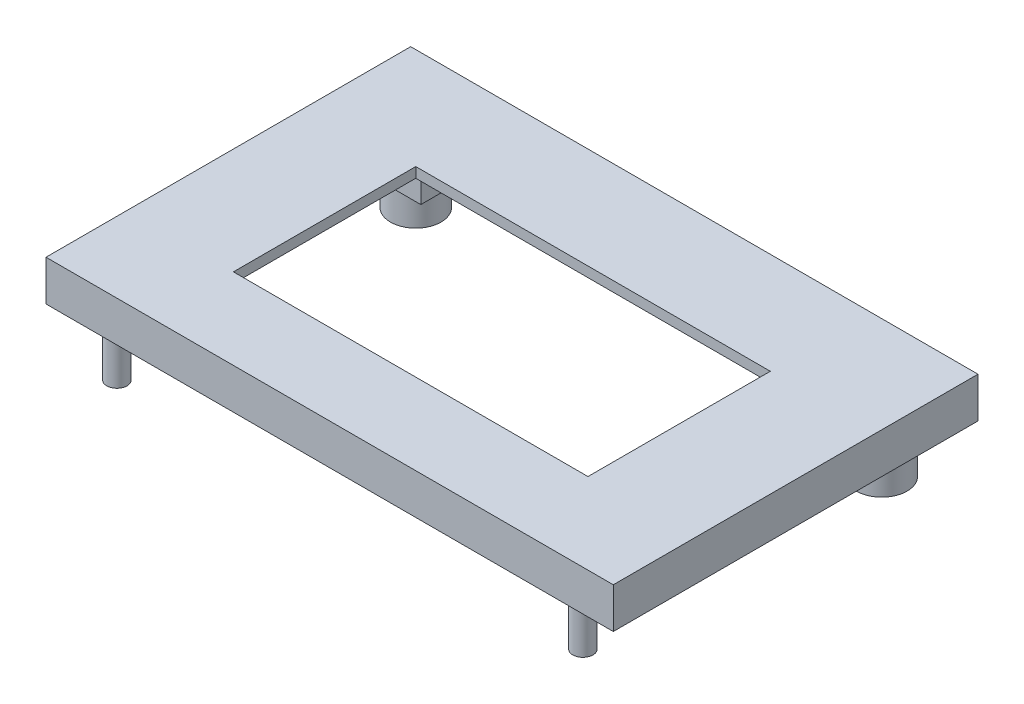
ISO-10303-21;
HEADER;
FILE_DESCRIPTION(('STEP AP214'),'2;1');
FILE_NAME('part.step','',(''),(''),'','','');
FILE_SCHEMA(('AUTOMOTIVE_DESIGN { 1 0 10303 214 1 1 1 1 }'));
ENDSEC;
DATA;
#1=APPLICATION_CONTEXT('core data for automotive mechanical design processes');
#2=APPLICATION_PROTOCOL_DEFINITION('international standard','automotive_design',2000,#1);
#3=PRODUCT_CONTEXT('',#1,'mechanical');
#4=PRODUCT('Part','Part','',(#3));
#5=PRODUCT_RELATED_PRODUCT_CATEGORY('part','',(#4));
#6=PRODUCT_DEFINITION_FORMATION('','',#4);
#7=PRODUCT_DEFINITION_CONTEXT('part definition',#1,'design');
#8=PRODUCT_DEFINITION('design','',#6,#7);
#9=PRODUCT_DEFINITION_SHAPE('','',#8);
#10=(LENGTH_UNIT() NAMED_UNIT(*) SI_UNIT(.MILLI.,.METRE.));
#11=(NAMED_UNIT(*) PLANE_ANGLE_UNIT() SI_UNIT($,.RADIAN.));
#12=(NAMED_UNIT(*) SI_UNIT($,.STERADIAN.) SOLID_ANGLE_UNIT());
#13=UNCERTAINTY_MEASURE_WITH_UNIT(LENGTH_MEASURE(1.E-05),#10,'distance_accuracy_value','');
#14=(GEOMETRIC_REPRESENTATION_CONTEXT(3) GLOBAL_UNCERTAINTY_ASSIGNED_CONTEXT((#13)) GLOBAL_UNIT_ASSIGNED_CONTEXT((#10,
#11,#12)) REPRESENTATION_CONTEXT('',''));
#15=CARTESIAN_POINT('',(0.,0.,0.));
#16=DIRECTION('',(0.,0.,1.));
#17=DIRECTION('',(1.,0.,0.));
#18=AXIS2_PLACEMENT_3D('',#15,#16,#17);
#19=CARTESIAN_POINT('',(0.,3.,32.));
#20=DIRECTION('',(0.,0.,-1.));
#21=DIRECTION('',(-1.,0.,0.));
#22=AXIS2_PLACEMENT_3D('',#19,#20,#21);
#23=PLANE('',#22);
#24=DIRECTION('',(1.,0.,0.));
#25=VECTOR('',#24,1.);
#26=CARTESIAN_POINT('',(0.,0.,32.));
#27=LINE('',#26,#25);
#28=CARTESIAN_POINT('',(46.,0.,32.));
#29=VERTEX_POINT('',#28);
#30=CARTESIAN_POINT('',(55.,0.,32.));
#31=VERTEX_POINT('',#30);
#32=EDGE_CURVE('E131',#29,#31,#27,.T.);
#33=ORIENTED_EDGE('',*,*,#32,.F.);
#34=DIRECTION('',(0.,-1.,0.));
#35=VECTOR('',#34,1.);
#36=CARTESIAN_POINT('',(46.,3.,32.));
#37=LINE('',#36,#35);
#38=CARTESIAN_POINT('',(46.,3.,32.));
#39=VERTEX_POINT('',#38);
#40=EDGE_CURVE('E163',#39,#29,#37,.T.);
#41=ORIENTED_EDGE('',*,*,#40,.F.);
#42=DIRECTION('',(1.,0.,0.));
#43=VECTOR('',#42,1.);
#44=CARTESIAN_POINT('',(0.,3.,32.));
#45=LINE('',#44,#43);
#46=CARTESIAN_POINT('',(55.,3.,32.));
#47=VERTEX_POINT('',#46);
#48=EDGE_CURVE('E132',#39,#47,#45,.T.);
#49=ORIENTED_EDGE('',*,*,#48,.T.);
#50=DIRECTION('',(0.,-1.,0.));
#51=VECTOR('',#50,1.);
#52=CARTESIAN_POINT('',(55.,3.,32.));
#53=LINE('',#52,#51);
#54=EDGE_CURVE('E115',#47,#31,#53,.T.);
#55=ORIENTED_EDGE('',*,*,#54,.T.);
#56=EDGE_LOOP('',(#33,#41,#49,#55));
#57=FACE_BOUND('',#56,.T.);
#58=ADVANCED_FACE('F37',(#57),#23,.T.);
#59=CARTESIAN_POINT('',(46.,3.,0.));
#60=DIRECTION('',(1.,0.,0.));
#61=DIRECTION('',(0.,0.,-1.));
#62=AXIS2_PLACEMENT_3D('',#59,#60,#61);
#63=PLANE('',#62);
#64=DIRECTION('',(0.,0.,1.));
#65=VECTOR('',#64,1.);
#66=CARTESIAN_POINT('',(46.,0.,0.));
#67=LINE('',#66,#65);
#68=CARTESIAN_POINT('',(46.,0.,35.));
#69=VERTEX_POINT('',#68);
#70=EDGE_CURVE('E217',#29,#69,#67,.T.);
#71=ORIENTED_EDGE('',*,*,#70,.T.);
#72=DIRECTION('',(0.,-1.,0.));
#73=VECTOR('',#72,1.);
#74=CARTESIAN_POINT('',(46.,3.,35.));
#75=LINE('',#74,#73);
#76=CARTESIAN_POINT('',(46.,3.,35.));
#77=VERTEX_POINT('',#76);
#78=EDGE_CURVE('E161',#77,#69,#75,.T.);
#79=ORIENTED_EDGE('',*,*,#78,.F.);
#80=DIRECTION('',(0.,0.,1.));
#81=VECTOR('',#80,1.);
#82=CARTESIAN_POINT('',(46.,3.,0.));
#83=LINE('',#82,#81);
#84=EDGE_CURVE('E135',#39,#77,#83,.T.);
#85=ORIENTED_EDGE('',*,*,#84,.F.);
#86=ORIENTED_EDGE('',*,*,#40,.T.);
#87=EDGE_LOOP('',(#71,#79,#85,#86));
#88=FACE_BOUND('',#87,.T.);
#89=ADVANCED_FACE('F280',(#88),#63,.F.);
#90=CARTESIAN_POINT('',(0.,3.,35.));
#91=DIRECTION('',(0.,0.,-1.));
#92=DIRECTION('',(-1.,0.,0.));
#93=AXIS2_PLACEMENT_3D('',#90,#91,#92);
#94=PLANE('',#93);
#95=DIRECTION('',(1.,0.,0.));
#96=VECTOR('',#95,1.);
#97=CARTESIAN_POINT('',(0.,0.,35.));
#98=LINE('',#97,#96);
#99=CARTESIAN_POINT('',(10.,0.,35.));
#100=VERTEX_POINT('',#99);
#101=EDGE_CURVE('E221',#100,#69,#98,.T.);
#102=ORIENTED_EDGE('',*,*,#101,.F.);
#103=DIRECTION('',(0.,-1.,0.));
#104=VECTOR('',#103,1.);
#105=CARTESIAN_POINT('',(10.,3.,35.));
#106=LINE('',#105,#104);
#107=CARTESIAN_POINT('',(10.,3.,35.));
#108=VERTEX_POINT('',#107);
#109=EDGE_CURVE('E159',#108,#100,#106,.T.);
#110=ORIENTED_EDGE('',*,*,#109,.F.);
#111=DIRECTION('',(1.,0.,0.));
#112=VECTOR('',#111,1.);
#113=CARTESIAN_POINT('',(0.,3.,35.));
#114=LINE('',#113,#112);
#115=EDGE_CURVE('E282',#108,#77,#114,.T.);
#116=ORIENTED_EDGE('',*,*,#115,.T.);
#117=ORIENTED_EDGE('',*,*,#78,.T.);
#118=EDGE_LOOP('',(#102,#110,#116,#117));
#119=FACE_BOUND('',#118,.T.);
#120=ADVANCED_FACE('F319',(#119),#94,.T.);
#121=CARTESIAN_POINT('',(10.,3.,0.));
#122=DIRECTION('',(1.,0.,0.));
#123=DIRECTION('',(0.,0.,-1.));
#124=AXIS2_PLACEMENT_3D('',#121,#122,#123);
#125=PLANE('',#124);
#126=DIRECTION('',(0.,0.,1.));
#127=VECTOR('',#126,1.);
#128=CARTESIAN_POINT('',(10.,0.,0.));
#129=LINE('',#128,#127);
#130=CARTESIAN_POINT('',(10.,0.,32.));
#131=VERTEX_POINT('',#130);
#132=EDGE_CURVE('E224',#131,#100,#129,.T.);
#133=ORIENTED_EDGE('',*,*,#132,.F.);
#134=DIRECTION('',(0.,-1.,0.));
#135=VECTOR('',#134,1.);
#136=CARTESIAN_POINT('',(10.,3.,32.));
#137=LINE('',#136,#135);
#138=CARTESIAN_POINT('',(10.,3.,32.));
#139=VERTEX_POINT('',#138);
#140=EDGE_CURVE('E157',#139,#131,#137,.T.);
#141=ORIENTED_EDGE('',*,*,#140,.F.);
#142=DIRECTION('',(0.,0.,1.));
#143=VECTOR('',#142,1.);
#144=CARTESIAN_POINT('',(10.,3.,0.));
#145=LINE('',#144,#143);
#146=EDGE_CURVE('E284',#139,#108,#145,.T.);
#147=ORIENTED_EDGE('',*,*,#146,.T.);
#148=ORIENTED_EDGE('',*,*,#109,.T.);
#149=EDGE_LOOP('',(#133,#141,#147,#148));
#150=FACE_BOUND('',#149,.T.);
#151=ADVANCED_FACE('F315',(#150),#125,.T.);
#152=CARTESIAN_POINT('',(1.,0.,32.));
#153=VERTEX_POINT('',#152);
#154=EDGE_CURVE('E218',#153,#131,#27,.T.);
#155=ORIENTED_EDGE('',*,*,#154,.F.);
#156=DIRECTION('',(0.,-1.,0.));
#157=VECTOR('',#156,1.);
#158=CARTESIAN_POINT('',(1.,3.,32.));
#159=LINE('',#158,#157);
#160=CARTESIAN_POINT('',(1.,3.,32.));
#161=VERTEX_POINT('',#160);
#162=EDGE_CURVE('E155',#161,#153,#159,.T.);
#163=ORIENTED_EDGE('',*,*,#162,.F.);
#164=EDGE_CURVE('E137',#161,#139,#45,.T.);
#165=ORIENTED_EDGE('',*,*,#164,.T.);
#166=ORIENTED_EDGE('',*,*,#140,.T.);
#167=EDGE_LOOP('',(#155,#163,#165,#166));
#168=FACE_BOUND('',#167,.T.);
#169=ADVANCED_FACE('F309',(#168),#23,.T.);
#170=CARTESIAN_POINT('',(1.,3.,0.));
#171=DIRECTION('',(-1.,0.,0.));
#172=DIRECTION('',(0.,0.,1.));
#173=AXIS2_PLACEMENT_3D('',#170,#171,#172);
#174=PLANE('',#173);
#175=DIRECTION('',(0.,0.,-1.));
#176=VECTOR('',#175,1.);
#177=CARTESIAN_POINT('',(1.,0.,0.));
#178=LINE('',#177,#176);
#179=CARTESIAN_POINT('',(1.,0.,9.));
#180=VERTEX_POINT('',#179);
#181=EDGE_CURVE('E227',#153,#180,#178,.T.);
#182=ORIENTED_EDGE('',*,*,#181,.T.);
#183=DIRECTION('',(0.,-1.,0.));
#184=VECTOR('',#183,1.);
#185=CARTESIAN_POINT('',(1.,3.,9.));
#186=LINE('',#185,#184);
#187=CARTESIAN_POINT('',(1.,3.,9.));
#188=VERTEX_POINT('',#187);
#189=EDGE_CURVE('E152',#188,#180,#186,.T.);
#190=ORIENTED_EDGE('',*,*,#189,.F.);
#191=DIRECTION('',(0.,0.,-1.));
#192=VECTOR('',#191,1.);
#193=CARTESIAN_POINT('',(1.,3.,0.));
#194=LINE('',#193,#192);
#195=EDGE_CURVE('E289',#161,#188,#194,.T.);
#196=ORIENTED_EDGE('',*,*,#195,.F.);
#197=ORIENTED_EDGE('',*,*,#162,.T.);
#198=EDGE_LOOP('',(#182,#190,#196,#197));
#199=FACE_BOUND('',#198,.T.);
#200=ADVANCED_FACE('F320',(#199),#174,.F.);
#201=CARTESIAN_POINT('',(0.,3.,9.));
#202=DIRECTION('',(0.,0.,-1.));
#203=DIRECTION('',(-1.,0.,0.));
#204=AXIS2_PLACEMENT_3D('',#201,#202,#203);
#205=PLANE('',#204);
#206=DIRECTION('',(1.,0.,0.));
#207=VECTOR('',#206,1.);
#208=CARTESIAN_POINT('',(0.,0.,9.));
#209=LINE('',#208,#207);
#210=CARTESIAN_POINT('',(10.,0.,9.));
#211=VERTEX_POINT('',#210);
#212=EDGE_CURVE('E126',#180,#211,#209,.T.);
#213=ORIENTED_EDGE('',*,*,#212,.T.);
#214=DIRECTION('',(0.,-1.,0.));
#215=VECTOR('',#214,1.);
#216=CARTESIAN_POINT('',(10.,3.,9.));
#217=LINE('',#216,#215);
#218=CARTESIAN_POINT('',(10.,3.,9.));
#219=VERTEX_POINT('',#218);
#220=EDGE_CURVE('E149',#219,#211,#217,.T.);
#221=ORIENTED_EDGE('',*,*,#220,.F.);
#222=DIRECTION('',(1.,0.,0.));
#223=VECTOR('',#222,1.);
#224=CARTESIAN_POINT('',(0.,3.,9.));
#225=LINE('',#224,#223);
#226=EDGE_CURVE('E291',#188,#219,#225,.T.);
#227=ORIENTED_EDGE('',*,*,#226,.F.);
#228=ORIENTED_EDGE('',*,*,#189,.T.);
#229=EDGE_LOOP('',(#213,#221,#227,#228));
#230=FACE_BOUND('',#229,.T.);
#231=ADVANCED_FACE('F301',(#230),#205,.F.);
#232=CARTESIAN_POINT('',(10.,3.,0.));
#233=DIRECTION('',(-1.,0.,0.));
#234=DIRECTION('',(0.,0.,1.));
#235=AXIS2_PLACEMENT_3D('',#232,#233,#234);
#236=PLANE('',#235);
#237=DIRECTION('',(0.,0.,-1.));
#238=VECTOR('',#237,1.);
#239=CARTESIAN_POINT('',(10.,0.,0.));
#240=LINE('',#239,#238);
#241=CARTESIAN_POINT('',(10.,0.,1.));
#242=VERTEX_POINT('',#241);
#243=EDGE_CURVE('E231',#211,#242,#240,.T.);
#244=ORIENTED_EDGE('',*,*,#243,.T.);
#245=DIRECTION('',(0.,-1.,0.));
#246=VECTOR('',#245,1.);
#247=CARTESIAN_POINT('',(10.,3.,1.));
#248=LINE('',#247,#246);
#249=CARTESIAN_POINT('',(10.,3.,1.));
#250=VERTEX_POINT('',#249);
#251=EDGE_CURVE('E146',#250,#242,#248,.T.);
#252=ORIENTED_EDGE('',*,*,#251,.F.);
#253=DIRECTION('',(0.,0.,-1.));
#254=VECTOR('',#253,1.);
#255=CARTESIAN_POINT('',(10.,3.,0.));
#256=LINE('',#255,#254);
#257=EDGE_CURVE('E293',#219,#250,#256,.T.);
#258=ORIENTED_EDGE('',*,*,#257,.F.);
#259=ORIENTED_EDGE('',*,*,#220,.T.);
#260=EDGE_LOOP('',(#244,#252,#258,#259));
#261=FACE_BOUND('',#260,.T.);
#262=ADVANCED_FACE('F299',(#261),#236,.F.);
#263=CARTESIAN_POINT('',(0.,3.,1.));
#264=DIRECTION('',(0.,0.,-1.));
#265=DIRECTION('',(-1.,0.,0.));
#266=AXIS2_PLACEMENT_3D('',#263,#264,#265);
#267=PLANE('',#266);
#268=DIRECTION('',(1.,0.,0.));
#269=VECTOR('',#268,1.);
#270=CARTESIAN_POINT('',(0.,0.,1.));
#271=LINE('',#270,#269);
#272=CARTESIAN_POINT('',(46.,0.,1.));
#273=VERTEX_POINT('',#272);
#274=EDGE_CURVE('E233',#242,#273,#271,.T.);
#275=ORIENTED_EDGE('',*,*,#274,.T.);
#276=DIRECTION('',(0.,-1.,0.));
#277=VECTOR('',#276,1.);
#278=CARTESIAN_POINT('',(46.,3.,1.));
#279=LINE('',#278,#277);
#280=CARTESIAN_POINT('',(46.,3.,1.));
#281=VERTEX_POINT('',#280);
#282=EDGE_CURVE('E144',#281,#273,#279,.T.);
#283=ORIENTED_EDGE('',*,*,#282,.F.);
#284=DIRECTION('',(1.,0.,0.));
#285=VECTOR('',#284,1.);
#286=CARTESIAN_POINT('',(0.,3.,1.));
#287=LINE('',#286,#285);
#288=EDGE_CURVE('E247',#250,#281,#287,.T.);
#289=ORIENTED_EDGE('',*,*,#288,.F.);
#290=ORIENTED_EDGE('',*,*,#251,.T.);
#291=EDGE_LOOP('',(#275,#283,#289,#290));
#292=FACE_BOUND('',#291,.T.);
#293=ADVANCED_FACE('F244',(#292),#267,.F.);
#294=CARTESIAN_POINT('',(46.,3.,0.));
#295=DIRECTION('',(-1.,0.,0.));
#296=DIRECTION('',(0.,0.,1.));
#297=AXIS2_PLACEMENT_3D('',#294,#295,#296);
#298=PLANE('',#297);
#299=DIRECTION('',(0.,0.,-1.));
#300=VECTOR('',#299,1.);
#301=CARTESIAN_POINT('',(46.,0.,0.));
#302=LINE('',#301,#300);
#303=CARTESIAN_POINT('',(46.,0.,9.));
#304=VERTEX_POINT('',#303);
#305=EDGE_CURVE('E124',#304,#273,#302,.T.);
#306=ORIENTED_EDGE('',*,*,#305,.F.);
#307=DIRECTION('',(0.,-1.,0.));
#308=VECTOR('',#307,1.);
#309=CARTESIAN_POINT('',(46.,3.,9.));
#310=LINE('',#309,#308);
#311=CARTESIAN_POINT('',(46.,3.,9.));
#312=VERTEX_POINT('',#311);
#313=EDGE_CURVE('E114',#312,#304,#310,.T.);
#314=ORIENTED_EDGE('',*,*,#313,.F.);
#315=DIRECTION('',(0.,0.,-1.));
#316=VECTOR('',#315,1.);
#317=CARTESIAN_POINT('',(46.,3.,0.));
#318=LINE('',#317,#316);
#319=EDGE_CURVE('E242',#312,#281,#318,.T.);
#320=ORIENTED_EDGE('',*,*,#319,.T.);
#321=ORIENTED_EDGE('',*,*,#282,.T.);
#322=EDGE_LOOP('',(#306,#314,#320,#321));
#323=FACE_BOUND('',#322,.T.);
#324=ADVANCED_FACE('F238',(#323),#298,.T.);
#325=CARTESIAN_POINT('',(55.,0.,9.));
#326=VERTEX_POINT('',#325);
#327=EDGE_CURVE('E118',#304,#326,#209,.T.);
#328=ORIENTED_EDGE('',*,*,#327,.T.);
#329=DIRECTION('',(0.,-1.,0.));
#330=VECTOR('',#329,1.);
#331=CARTESIAN_POINT('',(55.,3.,9.));
#332=LINE('',#331,#330);
#333=CARTESIAN_POINT('',(55.,3.,9.));
#334=VERTEX_POINT('',#333);
#335=EDGE_CURVE('E106',#334,#326,#332,.T.);
#336=ORIENTED_EDGE('',*,*,#335,.F.);
#337=EDGE_CURVE('E53',#312,#334,#225,.T.);
#338=ORIENTED_EDGE('',*,*,#337,.F.);
#339=ORIENTED_EDGE('',*,*,#313,.T.);
#340=EDGE_LOOP('',(#328,#336,#338,#339));
#341=FACE_BOUND('',#340,.T.);
#342=ADVANCED_FACE('F119',(#341),#205,.F.);
#343=CARTESIAN_POINT('',(56.,3.,0.));
#344=DIRECTION('',(1.,0.,0.));
#345=DIRECTION('',(0.,0.,-1.));
#346=AXIS2_PLACEMENT_3D('',#343,#344,#345);
#347=PLANE('',#346);
#348=DIRECTION('',(0.,0.,1.));
#349=VECTOR('',#348,1.);
#350=CARTESIAN_POINT('',(56.,0.,0.));
#351=LINE('',#350,#349);
#352=CARTESIAN_POINT('',(56.,0.,0.));
#353=VERTEX_POINT('',#352);
#354=CARTESIAN_POINT('',(56.,0.,36.));
#355=VERTEX_POINT('',#354);
#356=EDGE_CURVE('E196',#353,#355,#351,.T.);
#357=ORIENTED_EDGE('',*,*,#356,.F.);
#358=DIRECTION('',(0.,-1.,0.));
#359=VECTOR('',#358,1.);
#360=CARTESIAN_POINT('',(56.,3.,0.));
#361=LINE('',#360,#359);
#362=CARTESIAN_POINT('',(56.,4.,0.));
#363=VERTEX_POINT('',#362);
#364=EDGE_CURVE('E141',#363,#353,#361,.T.);
#365=ORIENTED_EDGE('',*,*,#364,.F.);
#366=DIRECTION('',(0.,0.,-1.));
#367=VECTOR('',#366,1.);
#368=CARTESIAN_POINT('',(56.,4.,0.));
#369=LINE('',#368,#367);
#370=CARTESIAN_POINT('',(56.,4.,36.));
#371=VERTEX_POINT('',#370);
#372=EDGE_CURVE('E209',#371,#363,#369,.T.);
#373=ORIENTED_EDGE('',*,*,#372,.F.);
#374=DIRECTION('',(0.,-1.,0.));
#375=VECTOR('',#374,1.);
#376=CARTESIAN_POINT('',(56.,3.,36.));
#377=LINE('',#376,#375);
#378=EDGE_CURVE('E166',#371,#355,#377,.T.);
#379=ORIENTED_EDGE('',*,*,#378,.T.);
#380=EDGE_LOOP('',(#357,#365,#373,#379));
#381=FACE_BOUND('',#380,.T.);
#382=ADVANCED_FACE('F39',(#381),#347,.T.);
#383=CARTESIAN_POINT('',(0.,3.,0.));
#384=DIRECTION('',(0.,0.,-1.));
#385=DIRECTION('',(-1.,0.,0.));
#386=AXIS2_PLACEMENT_3D('',#383,#384,#385);
#387=PLANE('',#386);
#388=DIRECTION('',(1.,0.,0.));
#389=VECTOR('',#388,1.);
#390=CARTESIAN_POINT('',(0.,0.,0.));
#391=LINE('',#390,#389);
#392=CARTESIAN_POINT('',(0.,0.,0.));
#393=VERTEX_POINT('',#392);
#394=EDGE_CURVE('E201',#393,#353,#391,.T.);
#395=ORIENTED_EDGE('',*,*,#394,.F.);
#396=DIRECTION('',(0.,-1.,0.));
#397=VECTOR('',#396,1.);
#398=CARTESIAN_POINT('',(0.,3.,0.));
#399=LINE('',#398,#397);
#400=CARTESIAN_POINT('',(0.,4.,0.));
#401=VERTEX_POINT('',#400);
#402=EDGE_CURVE('E171',#401,#393,#399,.T.);
#403=ORIENTED_EDGE('',*,*,#402,.F.);
#404=DIRECTION('',(-1.,0.,0.));
#405=VECTOR('',#404,1.);
#406=CARTESIAN_POINT('',(0.,4.,0.));
#407=LINE('',#406,#405);
#408=EDGE_CURVE('E204',#363,#401,#407,.T.);
#409=ORIENTED_EDGE('',*,*,#408,.F.);
#410=ORIENTED_EDGE('',*,*,#364,.T.);
#411=EDGE_LOOP('',(#395,#403,#409,#410));
#412=FACE_BOUND('',#411,.T.);
#413=ADVANCED_FACE('F346',(#412),#387,.T.);
#414=CARTESIAN_POINT('',(0.,3.,0.));
#415=DIRECTION('',(1.,0.,0.));
#416=DIRECTION('',(0.,0.,-1.));
#417=AXIS2_PLACEMENT_3D('',#414,#415,#416);
#418=PLANE('',#417);
#419=DIRECTION('',(0.,0.,1.));
#420=VECTOR('',#419,1.);
#421=CARTESIAN_POINT('',(0.,0.,0.));
#422=LINE('',#421,#420);
#423=CARTESIAN_POINT('',(0.,0.,36.));
#424=VERTEX_POINT('',#423);
#425=EDGE_CURVE('E206',#393,#424,#422,.T.);
#426=ORIENTED_EDGE('',*,*,#425,.T.);
#427=DIRECTION('',(0.,-1.,0.));
#428=VECTOR('',#427,1.);
#429=CARTESIAN_POINT('',(0.,3.,36.));
#430=LINE('',#429,#428);
#431=CARTESIAN_POINT('',(0.,4.,36.));
#432=VERTEX_POINT('',#431);
#433=EDGE_CURVE('E168',#432,#424,#430,.T.);
#434=ORIENTED_EDGE('',*,*,#433,.F.);
#435=DIRECTION('',(0.,0.,1.));
#436=VECTOR('',#435,1.);
#437=CARTESIAN_POINT('',(0.,4.,0.));
#438=LINE('',#437,#436);
#439=EDGE_CURVE('E369',#401,#432,#438,.T.);
#440=ORIENTED_EDGE('',*,*,#439,.F.);
#441=ORIENTED_EDGE('',*,*,#402,.T.);
#442=EDGE_LOOP('',(#426,#434,#440,#441));
#443=FACE_BOUND('',#442,.T.);
#444=ADVANCED_FACE('F343',(#443),#418,.F.);
#445=CARTESIAN_POINT('',(0.,3.,36.));
#446=DIRECTION('',(0.,0.,-1.));
#447=DIRECTION('',(-1.,0.,0.));
#448=AXIS2_PLACEMENT_3D('',#445,#446,#447);
#449=PLANE('',#448);
#450=DIRECTION('',(1.,0.,0.));
#451=VECTOR('',#450,1.);
#452=CARTESIAN_POINT('',(0.,0.,36.));
#453=LINE('',#452,#451);
#454=EDGE_CURVE('E199',#424,#355,#453,.T.);
#455=ORIENTED_EDGE('',*,*,#454,.T.);
#456=ORIENTED_EDGE('',*,*,#378,.F.);
#457=DIRECTION('',(1.,0.,0.));
#458=VECTOR('',#457,1.);
#459=CARTESIAN_POINT('',(0.,4.,36.));
#460=LINE('',#459,#458);
#461=EDGE_CURVE('E367',#432,#371,#460,.T.);
#462=ORIENTED_EDGE('',*,*,#461,.F.);
#463=ORIENTED_EDGE('',*,*,#433,.T.);
#464=EDGE_LOOP('',(#455,#456,#462,#463));
#465=FACE_BOUND('',#464,.T.);
#466=ADVANCED_FACE('F340',(#465),#449,.F.);
#467=CARTESIAN_POINT('',(55.,3.,0.));
#468=DIRECTION('',(-1.,0.,0.));
#469=DIRECTION('',(0.,0.,1.));
#470=AXIS2_PLACEMENT_3D('',#467,#468,#469);
#471=PLANE('',#470);
#472=DIRECTION('',(0.,0.,-1.));
#473=VECTOR('',#472,1.);
#474=CARTESIAN_POINT('',(55.,0.,0.));
#475=LINE('',#474,#473);
#476=EDGE_CURVE('E111',#31,#326,#475,.T.);
#477=ORIENTED_EDGE('',*,*,#476,.F.);
#478=ORIENTED_EDGE('',*,*,#54,.F.);
#479=DIRECTION('',(0.,0.,-1.));
#480=VECTOR('',#479,1.);
#481=CARTESIAN_POINT('',(55.,3.,0.));
#482=LINE('',#481,#480);
#483=EDGE_CURVE('E112',#47,#334,#482,.T.);
#484=ORIENTED_EDGE('',*,*,#483,.T.);
#485=ORIENTED_EDGE('',*,*,#335,.T.);
#486=EDGE_LOOP('',(#477,#478,#484,#485));
#487=FACE_BOUND('',#486,.T.);
#488=ADVANCED_FACE('F108',(#487),#471,.T.);
#489=CARTESIAN_POINT('',(0.,0.,0.));
#490=DIRECTION('',(0.,1.,0.));
#491=DIRECTION('',(0.,0.,1.));
#492=AXIS2_PLACEMENT_3D('',#489,#490,#491);
#493=PLANE('',#492);
#494=CARTESIAN_POINT('',(5.,0.,4.5));
#495=DIRECTION('',(0.,1.,0.));
#496=DIRECTION('',(0.,0.,1.));
#497=AXIS2_PLACEMENT_3D('',#494,#495,#496);
#498=CIRCLE('',#497,2.5);
#499=CARTESIAN_POINT('',(5.,0.,7.));
#500=VERTEX_POINT('',#499);
#501=EDGE_CURVE('E11',#500,#500,#498,.F.);
#502=ORIENTED_EDGE('',*,*,#501,.F.);
#503=EDGE_LOOP('',(#502));
#504=FACE_BOUND('',#503,.T.);
#505=CARTESIAN_POINT('',(51.,0.,4.5));
#506=DIRECTION('',(0.,1.,0.));
#507=DIRECTION('',(0.,0.,1.));
#508=AXIS2_PLACEMENT_3D('',#505,#506,#507);
#509=CIRCLE('',#508,2.5);
#510=CARTESIAN_POINT('',(51.,0.,7.));
#511=VERTEX_POINT('',#510);
#512=EDGE_CURVE('E46',#511,#511,#509,.F.);
#513=ORIENTED_EDGE('',*,*,#512,.F.);
#514=EDGE_LOOP('',(#513));
#515=FACE_BOUND('',#514,.T.);
#516=CARTESIAN_POINT('',(5.,0.,34.));
#517=DIRECTION('',(0.,1.,0.));
#518=DIRECTION('',(0.,0.,1.));
#519=AXIS2_PLACEMENT_3D('',#516,#517,#518);
#520=CIRCLE('',#519,1.);
#521=CARTESIAN_POINT('',(5.,0.,35.));
#522=VERTEX_POINT('',#521);
#523=EDGE_CURVE('E176',#522,#522,#520,.F.);
#524=ORIENTED_EDGE('',*,*,#523,.F.);
#525=EDGE_LOOP('',(#524));
#526=FACE_BOUND('',#525,.T.);
#527=CARTESIAN_POINT('',(51.,0.,34.));
#528=DIRECTION('',(0.,1.,0.));
#529=DIRECTION('',(0.,0.,1.));
#530=AXIS2_PLACEMENT_3D('',#527,#528,#529);
#531=CIRCLE('',#530,0.999999999999998);
#532=CARTESIAN_POINT('',(51.,0.,35.));
#533=VERTEX_POINT('',#532);
#534=EDGE_CURVE('E165',#533,#533,#531,.F.);
#535=ORIENTED_EDGE('',*,*,#534,.F.);
#536=EDGE_LOOP('',(#535));
#537=FACE_BOUND('',#536,.T.);
#538=ORIENTED_EDGE('',*,*,#356,.T.);
#539=ORIENTED_EDGE('',*,*,#454,.F.);
#540=ORIENTED_EDGE('',*,*,#425,.F.);
#541=ORIENTED_EDGE('',*,*,#394,.T.);
#542=EDGE_LOOP('',(#538,#539,#540,#541));
#543=FACE_BOUND('',#542,.T.);
#544=ORIENTED_EDGE('',*,*,#32,.T.);
#545=ORIENTED_EDGE('',*,*,#476,.T.);
#546=ORIENTED_EDGE('',*,*,#327,.F.);
#547=ORIENTED_EDGE('',*,*,#305,.T.);
#548=ORIENTED_EDGE('',*,*,#274,.F.);
#549=ORIENTED_EDGE('',*,*,#243,.F.);
#550=ORIENTED_EDGE('',*,*,#212,.F.);
#551=ORIENTED_EDGE('',*,*,#181,.F.);
#552=ORIENTED_EDGE('',*,*,#154,.T.);
#553=ORIENTED_EDGE('',*,*,#132,.T.);
#554=ORIENTED_EDGE('',*,*,#101,.T.);
#555=ORIENTED_EDGE('',*,*,#70,.F.);
#556=EDGE_LOOP('',(#544,#545,#546,#547,#548,#549,#550,#551,#552,#553,#554,#555));
#557=FACE_BOUND('',#556,.T.);
#558=ADVANCED_FACE('F128',(#504,#515,#526,#537,#543,#557),#493,.F.);
#559=CARTESIAN_POINT('',(0.,4.,0.));
#560=DIRECTION('',(0.,1.,0.));
#561=DIRECTION('',(0.,0.,1.));
#562=AXIS2_PLACEMENT_3D('',#559,#560,#561);
#563=PLANE('',#562);
#564=ORIENTED_EDGE('',*,*,#439,.T.);
#565=ORIENTED_EDGE('',*,*,#461,.T.);
#566=ORIENTED_EDGE('',*,*,#372,.T.);
#567=ORIENTED_EDGE('',*,*,#408,.T.);
#568=EDGE_LOOP('',(#564,#565,#566,#567));
#569=FACE_BOUND('',#568,.T.);
#570=DIRECTION('',(1.,0.,0.));
#571=VECTOR('',#570,1.);
#572=CARTESIAN_POINT('',(10.5,4.,28.));
#573=LINE('',#572,#571);
#574=CARTESIAN_POINT('',(10.5,4.,28.));
#575=VERTEX_POINT('',#574);
#576=CARTESIAN_POINT('',(45.5,4.,28.));
#577=VERTEX_POINT('',#576);
#578=EDGE_CURVE('E405',#575,#577,#573,.T.);
#579=ORIENTED_EDGE('',*,*,#578,.F.);
#580=DIRECTION('',(0.,0.,1.));
#581=VECTOR('',#580,1.);
#582=CARTESIAN_POINT('',(10.5,4.,10.));
#583=LINE('',#582,#581);
#584=CARTESIAN_POINT('',(10.5,4.,10.));
#585=VERTEX_POINT('',#584);
#586=EDGE_CURVE('E389',#585,#575,#583,.T.);
#587=ORIENTED_EDGE('',*,*,#586,.F.);
#588=DIRECTION('',(-1.,0.,0.));
#589=VECTOR('',#588,1.);
#590=CARTESIAN_POINT('',(10.5,4.,10.));
#591=LINE('',#590,#589);
#592=CARTESIAN_POINT('',(45.5,4.,10.));
#593=VERTEX_POINT('',#592);
#594=EDGE_CURVE('E385',#593,#585,#591,.T.);
#595=ORIENTED_EDGE('',*,*,#594,.F.);
#596=DIRECTION('',(0.,0.,-1.));
#597=VECTOR('',#596,1.);
#598=CARTESIAN_POINT('',(45.5,4.,10.));
#599=LINE('',#598,#597);
#600=EDGE_CURVE('E402',#577,#593,#599,.T.);
#601=ORIENTED_EDGE('',*,*,#600,.F.);
#602=EDGE_LOOP('',(#579,#587,#595,#601));
#603=FACE_BOUND('',#602,.T.);
#604=ADVANCED_FACE('F185',(#569,#603),#563,.T.);
#605=CARTESIAN_POINT('',(0.,3.,0.));
#606=DIRECTION('',(0.,1.,0.));
#607=DIRECTION('',(0.,0.,1.));
#608=AXIS2_PLACEMENT_3D('',#605,#606,#607);
#609=PLANE('',#608);
#610=ORIENTED_EDGE('',*,*,#48,.F.);
#611=ORIENTED_EDGE('',*,*,#84,.T.);
#612=ORIENTED_EDGE('',*,*,#115,.F.);
#613=ORIENTED_EDGE('',*,*,#146,.F.);
#614=ORIENTED_EDGE('',*,*,#164,.F.);
#615=ORIENTED_EDGE('',*,*,#195,.T.);
#616=ORIENTED_EDGE('',*,*,#226,.T.);
#617=ORIENTED_EDGE('',*,*,#257,.T.);
#618=ORIENTED_EDGE('',*,*,#288,.T.);
#619=ORIENTED_EDGE('',*,*,#319,.F.);
#620=ORIENTED_EDGE('',*,*,#337,.T.);
#621=ORIENTED_EDGE('',*,*,#483,.F.);
#622=EDGE_LOOP('',(#610,#611,#612,#613,#614,#615,#616,#617,#618,#619,#620,#621));
#623=FACE_BOUND('',#622,.T.);
#624=DIRECTION('',(0.,0.,1.));
#625=VECTOR('',#624,1.);
#626=CARTESIAN_POINT('',(10.5,3.,10.));
#627=LINE('',#626,#625);
#628=CARTESIAN_POINT('',(10.5,3.,10.));
#629=VERTEX_POINT('',#628);
#630=CARTESIAN_POINT('',(10.5,3.,28.));
#631=VERTEX_POINT('',#630);
#632=EDGE_CURVE('E396',#629,#631,#627,.T.);
#633=ORIENTED_EDGE('',*,*,#632,.T.);
#634=DIRECTION('',(1.,0.,0.));
#635=VECTOR('',#634,1.);
#636=CARTESIAN_POINT('',(10.5,3.,28.));
#637=LINE('',#636,#635);
#638=CARTESIAN_POINT('',(45.5,3.,28.));
#639=VERTEX_POINT('',#638);
#640=EDGE_CURVE('E393',#631,#639,#637,.T.);
#641=ORIENTED_EDGE('',*,*,#640,.T.);
#642=DIRECTION('',(0.,0.,-1.));
#643=VECTOR('',#642,1.);
#644=CARTESIAN_POINT('',(45.5,3.,10.));
#645=LINE('',#644,#643);
#646=CARTESIAN_POINT('',(45.5,3.,10.));
#647=VERTEX_POINT('',#646);
#648=EDGE_CURVE('E390',#639,#647,#645,.T.);
#649=ORIENTED_EDGE('',*,*,#648,.T.);
#650=DIRECTION('',(-1.,0.,0.));
#651=VECTOR('',#650,1.);
#652=CARTESIAN_POINT('',(10.5,3.,10.));
#653=LINE('',#652,#651);
#654=EDGE_CURVE('E386',#647,#629,#653,.T.);
#655=ORIENTED_EDGE('',*,*,#654,.T.);
#656=EDGE_LOOP('',(#633,#641,#649,#655));
#657=FACE_BOUND('',#656,.T.);
#658=ADVANCED_FACE('F276',(#623,#657),#609,.F.);
#659=CARTESIAN_POINT('',(10.5,4.,10.));
#660=DIRECTION('',(1.,0.,0.));
#661=DIRECTION('',(0.,0.,-1.));
#662=AXIS2_PLACEMENT_3D('',#659,#660,#661);
#663=PLANE('',#662);
#664=ORIENTED_EDGE('',*,*,#632,.F.);
#665=DIRECTION('',(0.,-1.,0.));
#666=VECTOR('',#665,1.);
#667=CARTESIAN_POINT('',(10.5,4.,10.));
#668=LINE('',#667,#666);
#669=EDGE_CURVE('E382',#585,#629,#668,.T.);
#670=ORIENTED_EDGE('',*,*,#669,.F.);
#671=ORIENTED_EDGE('',*,*,#586,.T.);
#672=DIRECTION('',(0.,-1.,0.));
#673=VECTOR('',#672,1.);
#674=CARTESIAN_POINT('',(10.5,4.,28.));
#675=LINE('',#674,#673);
#676=EDGE_CURVE('E373',#575,#631,#675,.T.);
#677=ORIENTED_EDGE('',*,*,#676,.T.);
#678=EDGE_LOOP('',(#664,#670,#671,#677));
#679=FACE_BOUND('',#678,.T.);
#680=ADVANCED_FACE('F468',(#679),#663,.T.);
#681=CARTESIAN_POINT('',(10.5,4.,28.));
#682=DIRECTION('',(0.,0.,-1.));
#683=DIRECTION('',(-1.,0.,0.));
#684=AXIS2_PLACEMENT_3D('',#681,#682,#683);
#685=PLANE('',#684);
#686=ORIENTED_EDGE('',*,*,#640,.F.);
#687=ORIENTED_EDGE('',*,*,#676,.F.);
#688=ORIENTED_EDGE('',*,*,#578,.T.);
#689=DIRECTION('',(0.,-1.,0.));
#690=VECTOR('',#689,1.);
#691=CARTESIAN_POINT('',(45.5,4.,28.));
#692=LINE('',#691,#690);
#693=EDGE_CURVE('E376',#577,#639,#692,.T.);
#694=ORIENTED_EDGE('',*,*,#693,.T.);
#695=EDGE_LOOP('',(#686,#687,#688,#694));
#696=FACE_BOUND('',#695,.T.);
#697=ADVANCED_FACE('F464',(#696),#685,.T.);
#698=CARTESIAN_POINT('',(45.5,4.,10.));
#699=DIRECTION('',(-1.,0.,0.));
#700=DIRECTION('',(0.,0.,1.));
#701=AXIS2_PLACEMENT_3D('',#698,#699,#700);
#702=PLANE('',#701);
#703=ORIENTED_EDGE('',*,*,#648,.F.);
#704=ORIENTED_EDGE('',*,*,#693,.F.);
#705=ORIENTED_EDGE('',*,*,#600,.T.);
#706=DIRECTION('',(0.,-1.,0.));
#707=VECTOR('',#706,1.);
#708=CARTESIAN_POINT('',(45.5,4.,10.));
#709=LINE('',#708,#707);
#710=EDGE_CURVE('E379',#593,#647,#709,.T.);
#711=ORIENTED_EDGE('',*,*,#710,.T.);
#712=EDGE_LOOP('',(#703,#704,#705,#711));
#713=FACE_BOUND('',#712,.T.);
#714=ADVANCED_FACE('F460',(#713),#702,.T.);
#715=CARTESIAN_POINT('',(10.5,4.,10.));
#716=DIRECTION('',(0.,0.,1.));
#717=DIRECTION('',(1.,0.,0.));
#718=AXIS2_PLACEMENT_3D('',#715,#716,#717);
#719=PLANE('',#718);
#720=ORIENTED_EDGE('',*,*,#654,.F.);
#721=ORIENTED_EDGE('',*,*,#710,.F.);
#722=ORIENTED_EDGE('',*,*,#594,.T.);
#723=ORIENTED_EDGE('',*,*,#669,.T.);
#724=EDGE_LOOP('',(#720,#721,#722,#723));
#725=FACE_BOUND('',#724,.T.);
#726=ADVANCED_FACE('F456',(#725),#719,.T.);
#727=CARTESIAN_POINT('',(51.,-5.,34.));
#728=DIRECTION('',(0.,1.,0.));
#729=DIRECTION('',(0.,0.,1.));
#730=AXIS2_PLACEMENT_3D('',#727,#728,#729);
#731=CYLINDRICAL_SURFACE('',#730,0.999999999999998);
#732=CARTESIAN_POINT('',(51.,-5.,34.));
#733=DIRECTION('',(0.,-1.,0.));
#734=DIRECTION('',(0.,0.,-1.));
#735=AXIS2_PLACEMENT_3D('',#732,#733,#734);
#736=CIRCLE('',#735,0.999999999999998);
#737=CARTESIAN_POINT('',(51.,-5.,33.));
#738=VERTEX_POINT('',#737);
#739=EDGE_CURVE('E399',#738,#738,#736,.T.);
#740=ORIENTED_EDGE('',*,*,#739,.F.);
#741=EDGE_LOOP('',(#740));
#742=FACE_BOUND('',#741,.T.);
#743=ORIENTED_EDGE('',*,*,#534,.T.);
#744=EDGE_LOOP('',(#743));
#745=FACE_BOUND('',#744,.T.);
#746=ADVANCED_FACE('F452',(#742,#745),#731,.T.);
#747=CARTESIAN_POINT('',(51.,-5.,34.));
#748=DIRECTION('',(0.,-1.,0.));
#749=DIRECTION('',(0.,0.,-1.));
#750=AXIS2_PLACEMENT_3D('',#747,#748,#749);
#751=PLANE('',#750);
#752=ORIENTED_EDGE('',*,*,#739,.T.);
#753=EDGE_LOOP('',(#752));
#754=FACE_BOUND('',#753,.T.);
#755=ADVANCED_FACE('F445',(#754),#751,.T.);
#756=CARTESIAN_POINT('',(5.,-5.,34.));
#757=DIRECTION('',(0.,1.,0.));
#758=DIRECTION('',(0.,0.,1.));
#759=AXIS2_PLACEMENT_3D('',#756,#757,#758);
#760=CYLINDRICAL_SURFACE('',#759,1.);
#761=CARTESIAN_POINT('',(5.,-5.,34.));
#762=DIRECTION('',(0.,-1.,0.));
#763=DIRECTION('',(0.,0.,-1.));
#764=AXIS2_PLACEMENT_3D('',#761,#762,#763);
#765=CIRCLE('',#764,1.);
#766=CARTESIAN_POINT('',(5.,-5.,33.));
#767=VERTEX_POINT('',#766);
#768=EDGE_CURVE('E412',#767,#767,#765,.T.);
#769=ORIENTED_EDGE('',*,*,#768,.F.);
#770=EDGE_LOOP('',(#769));
#771=FACE_BOUND('',#770,.T.);
#772=ORIENTED_EDGE('',*,*,#523,.T.);
#773=EDGE_LOOP('',(#772));
#774=FACE_BOUND('',#773,.T.);
#775=ADVANCED_FACE('F442',(#771,#774),#760,.T.);
#776=CARTESIAN_POINT('',(5.,-5.,34.));
#777=DIRECTION('',(0.,-1.,0.));
#778=DIRECTION('',(0.,0.,-1.));
#779=AXIS2_PLACEMENT_3D('',#776,#777,#778);
#780=PLANE('',#779);
#781=ORIENTED_EDGE('',*,*,#768,.T.);
#782=EDGE_LOOP('',(#781));
#783=FACE_BOUND('',#782,.T.);
#784=ADVANCED_FACE('F439',(#783),#780,.T.);
#785=CARTESIAN_POINT('',(51.,-5.,4.5));
#786=DIRECTION('',(0.,1.,0.));
#787=DIRECTION('',(0.,0.,1.));
#788=AXIS2_PLACEMENT_3D('',#785,#786,#787);
#789=CYLINDRICAL_SURFACE('',#788,2.5);
#790=CARTESIAN_POINT('',(51.,-5.,4.5));
#791=DIRECTION('',(0.,-1.,0.));
#792=DIRECTION('',(0.,0.,-1.));
#793=AXIS2_PLACEMENT_3D('',#790,#791,#792);
#794=CIRCLE('',#793,2.5);
#795=CARTESIAN_POINT('',(51.,-5.,2.));
#796=VERTEX_POINT('',#795);
#797=EDGE_CURVE('E415',#796,#796,#794,.T.);
#798=ORIENTED_EDGE('',*,*,#797,.F.);
#799=EDGE_LOOP('',(#798));
#800=FACE_BOUND('',#799,.T.);
#801=ORIENTED_EDGE('',*,*,#512,.T.);
#802=EDGE_LOOP('',(#801));
#803=FACE_BOUND('',#802,.T.);
#804=ADVANCED_FACE('F181',(#800,#803),#789,.T.);
#805=CARTESIAN_POINT('',(51.,-5.,4.5));
#806=DIRECTION('',(0.,-1.,0.));
#807=DIRECTION('',(0.,0.,-1.));
#808=AXIS2_PLACEMENT_3D('',#805,#806,#807);
#809=PLANE('',#808);
#810=ORIENTED_EDGE('',*,*,#797,.T.);
#811=EDGE_LOOP('',(#810));
#812=FACE_BOUND('',#811,.T.);
#813=ADVANCED_FACE('F427',(#812),#809,.T.);
#814=CARTESIAN_POINT('',(5.,-5.,4.5));
#815=DIRECTION('',(0.,1.,0.));
#816=DIRECTION('',(0.,0.,1.));
#817=AXIS2_PLACEMENT_3D('',#814,#815,#816);
#818=CYLINDRICAL_SURFACE('',#817,2.5);
#819=CARTESIAN_POINT('',(5.,-5.,4.5));
#820=DIRECTION('',(0.,-1.,0.));
#821=DIRECTION('',(0.,0.,-1.));
#822=AXIS2_PLACEMENT_3D('',#819,#820,#821);
#823=CIRCLE('',#822,2.5);
#824=CARTESIAN_POINT('',(5.,-5.,2.));
#825=VERTEX_POINT('',#824);
#826=EDGE_CURVE('E418',#825,#825,#823,.T.);
#827=ORIENTED_EDGE('',*,*,#826,.F.);
#828=EDGE_LOOP('',(#827));
#829=FACE_BOUND('',#828,.T.);
#830=ORIENTED_EDGE('',*,*,#501,.T.);
#831=EDGE_LOOP('',(#830));
#832=FACE_BOUND('',#831,.T.);
#833=ADVANCED_FACE('F424',(#829,#832),#818,.T.);
#834=CARTESIAN_POINT('',(5.,-5.,4.5));
#835=DIRECTION('',(0.,-1.,0.));
#836=DIRECTION('',(0.,0.,-1.));
#837=AXIS2_PLACEMENT_3D('',#834,#835,#836);
#838=PLANE('',#837);
#839=ORIENTED_EDGE('',*,*,#826,.T.);
#840=EDGE_LOOP('',(#839));
#841=FACE_BOUND('',#840,.T.);
#842=ADVANCED_FACE('F422',(#841),#838,.T.);
#843=CLOSED_SHELL('',(#58,#89,#120,#151,#169,#200,#231,#262,#293,#324,#342,#382,#413,#444,#466,
#488,#558,#604,#658,#680,#697,#714,#726,#746,#755,#775,#784,#804,#813,#833,#842));
#844=MANIFOLD_SOLID_BREP('B2',#843);
#845=ADVANCED_BREP_SHAPE_REPRESENTATION('',(#18,#844),#14);
#846=SHAPE_DEFINITION_REPRESENTATION(#9,#845);
ENDSEC;
END-ISO-10303-21;
